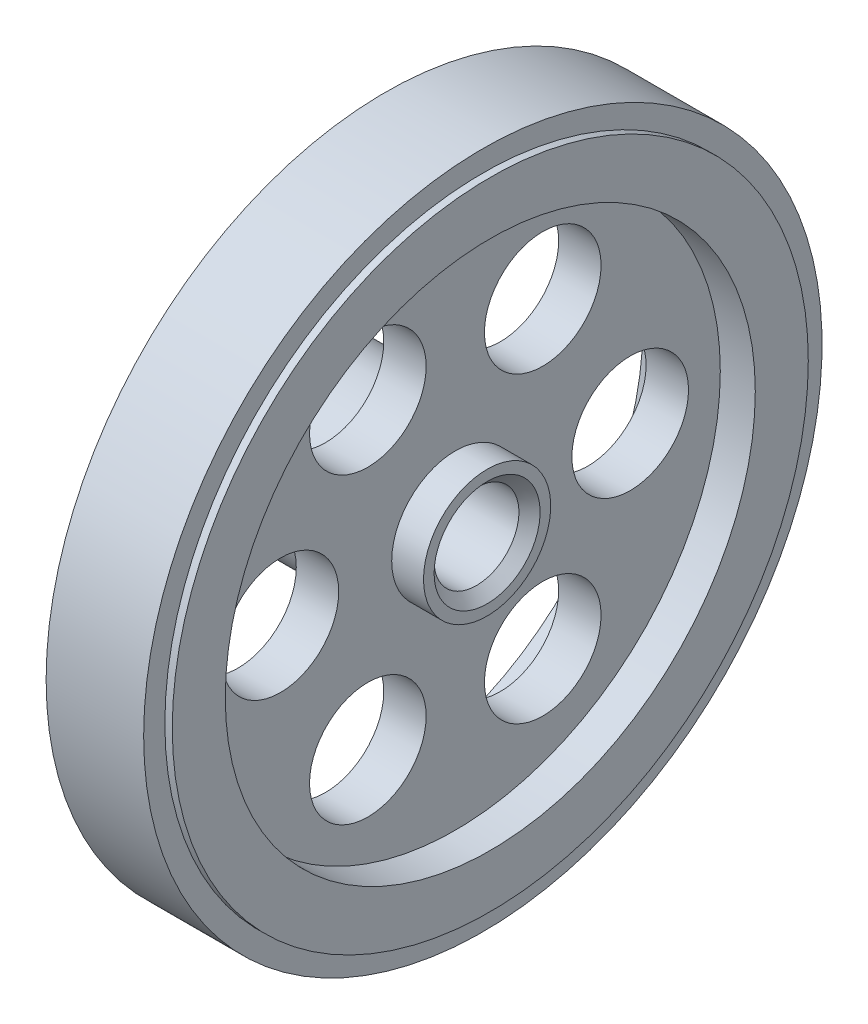
ISO-10303-21;
HEADER;
FILE_DESCRIPTION(('STEP AP214'),'2;1');
FILE_NAME('part.step','',(''),(''),'','','');
FILE_SCHEMA(('AUTOMOTIVE_DESIGN { 1 0 10303 214 1 1 1 1 }'));
ENDSEC;
DATA;
#1=APPLICATION_CONTEXT('core data for automotive mechanical design processes');
#2=APPLICATION_PROTOCOL_DEFINITION('international standard','automotive_design',2000,#1);
#3=PRODUCT_CONTEXT('',#1,'mechanical');
#4=PRODUCT('Part','Part','',(#3));
#5=PRODUCT_RELATED_PRODUCT_CATEGORY('part','',(#4));
#6=PRODUCT_DEFINITION_FORMATION('','',#4);
#7=PRODUCT_DEFINITION_CONTEXT('part definition',#1,'design');
#8=PRODUCT_DEFINITION('design','',#6,#7);
#9=PRODUCT_DEFINITION_SHAPE('','',#8);
#10=(LENGTH_UNIT() NAMED_UNIT(*) SI_UNIT(.MILLI.,.METRE.));
#11=(NAMED_UNIT(*) PLANE_ANGLE_UNIT() SI_UNIT($,.RADIAN.));
#12=(NAMED_UNIT(*) SI_UNIT($,.STERADIAN.) SOLID_ANGLE_UNIT());
#13=UNCERTAINTY_MEASURE_WITH_UNIT(LENGTH_MEASURE(1.E-05),#10,'distance_accuracy_value','');
#14=(GEOMETRIC_REPRESENTATION_CONTEXT(3) GLOBAL_UNCERTAINTY_ASSIGNED_CONTEXT((#13)) GLOBAL_UNIT_ASSIGNED_CONTEXT((#10,
#11,#12)) REPRESENTATION_CONTEXT('',''));
#15=CARTESIAN_POINT('',(0.,0.,0.));
#16=DIRECTION('',(0.,0.,1.));
#17=DIRECTION('',(1.,0.,0.));
#18=AXIS2_PLACEMENT_3D('',#15,#16,#17);
#19=CARTESIAN_POINT('',(17.,0.,-6.));
#20=DIRECTION('',(-1.,0.,0.));
#21=DIRECTION('',(0.,0.,1.));
#22=AXIS2_PLACEMENT_3D('',#19,#20,#21);
#23=PLANE('',#22);
#24=CARTESIAN_POINT('',(17.,0.,0.));
#25=DIRECTION('',(-1.,0.,0.));
#26=DIRECTION('',(0.,0.,1.));
#27=AXIS2_PLACEMENT_3D('',#24,#25,#26);
#28=CIRCLE('',#27,5.00000000000002);
#29=CARTESIAN_POINT('',(17.,0.,5.00000000000002));
#30=VERTEX_POINT('',#29);
#31=EDGE_CURVE('E10',#30,#30,#28,.T.);
#32=ORIENTED_EDGE('',*,*,#31,.T.);
#33=EDGE_LOOP('',(#32));
#34=FACE_BOUND('',#33,.T.);
#35=CARTESIAN_POINT('',(17.,0.,0.));
#36=DIRECTION('',(-1.,0.,0.));
#37=DIRECTION('',(0.,0.,1.));
#38=AXIS2_PLACEMENT_3D('',#35,#36,#37);
#39=CIRCLE('',#38,6.);
#40=CARTESIAN_POINT('',(17.,0.,6.));
#41=VERTEX_POINT('',#40);
#42=EDGE_CURVE('E89',#41,#41,#39,.T.);
#43=ORIENTED_EDGE('',*,*,#42,.F.);
#44=EDGE_LOOP('',(#43));
#45=FACE_BOUND('',#44,.T.);
#46=ADVANCED_FACE('F39',(#34,#45),#23,.F.);
#47=CARTESIAN_POINT('',(0.,0.,0.));
#48=DIRECTION('',(-1.,0.,0.));
#49=DIRECTION('',(0.,0.,1.));
#50=AXIS2_PLACEMENT_3D('',#47,#48,#49);
#51=CYLINDRICAL_SURFACE('',#50,4.);
#52=CARTESIAN_POINT('',(1.00000000000002,0.,0.));
#53=DIRECTION('',(1.,0.,0.));
#54=DIRECTION('',(0.,0.,-1.));
#55=AXIS2_PLACEMENT_3D('',#52,#53,#54);
#56=CIRCLE('',#55,4.);
#57=CARTESIAN_POINT('',(1.00000000000002,0.,-4.));
#58=VERTEX_POINT('',#57);
#59=EDGE_CURVE('E53',#58,#58,#56,.F.);
#60=ORIENTED_EDGE('',*,*,#59,.T.);
#61=EDGE_LOOP('',(#60));
#62=FACE_BOUND('',#61,.T.);
#63=CARTESIAN_POINT('',(16.,0.,0.));
#64=DIRECTION('',(-1.,0.,0.));
#65=DIRECTION('',(0.,0.,1.));
#66=AXIS2_PLACEMENT_3D('',#63,#64,#65);
#67=CIRCLE('',#66,4.);
#68=CARTESIAN_POINT('',(16.,0.,4.));
#69=VERTEX_POINT('',#68);
#70=EDGE_CURVE('E131',#69,#69,#67,.F.);
#71=ORIENTED_EDGE('',*,*,#70,.T.);
#72=EDGE_LOOP('',(#71));
#73=FACE_BOUND('',#72,.T.);
#74=ADVANCED_FACE('F136',(#62,#73),#51,.F.);
#75=CARTESIAN_POINT('',(0.,0.,-4.));
#76=DIRECTION('',(1.,0.,0.));
#77=DIRECTION('',(0.,0.,-1.));
#78=AXIS2_PLACEMENT_3D('',#75,#76,#77);
#79=PLANE('',#78);
#80=CARTESIAN_POINT('',(0.,0.,0.));
#81=DIRECTION('',(1.,0.,0.));
#82=DIRECTION('',(0.,0.,-1.));
#83=AXIS2_PLACEMENT_3D('',#80,#81,#82);
#84=CIRCLE('',#83,5.00000000000002);
#85=CARTESIAN_POINT('',(0.,0.,-5.00000000000002));
#86=VERTEX_POINT('',#85);
#87=EDGE_CURVE('E48',#86,#86,#84,.T.);
#88=ORIENTED_EDGE('',*,*,#87,.T.);
#89=EDGE_LOOP('',(#88));
#90=FACE_BOUND('',#89,.T.);
#91=CARTESIAN_POINT('',(0.,0.,0.));
#92=DIRECTION('',(-1.,0.,0.));
#93=DIRECTION('',(0.,0.,1.));
#94=AXIS2_PLACEMENT_3D('',#91,#92,#93);
#95=CIRCLE('',#94,8.);
#96=CARTESIAN_POINT('',(0.,0.,8.));
#97=VERTEX_POINT('',#96);
#98=EDGE_CURVE('E128',#97,#97,#95,.T.);
#99=ORIENTED_EDGE('',*,*,#98,.T.);
#100=EDGE_LOOP('',(#99));
#101=FACE_BOUND('',#100,.T.);
#102=ADVANCED_FACE('F159',(#90,#101),#79,.F.);
#103=CARTESIAN_POINT('',(0.,0.,0.));
#104=DIRECTION('',(-1.,0.,0.));
#105=DIRECTION('',(0.,0.,1.));
#106=AXIS2_PLACEMENT_3D('',#103,#104,#105);
#107=CYLINDRICAL_SURFACE('',#106,8.);
#108=ORIENTED_EDGE('',*,*,#98,.F.);
#109=EDGE_LOOP('',(#108));
#110=FACE_BOUND('',#109,.T.);
#111=CARTESIAN_POINT('',(10.,0.,0.));
#112=DIRECTION('',(-1.,0.,0.));
#113=DIRECTION('',(0.,0.,1.));
#114=AXIS2_PLACEMENT_3D('',#111,#112,#113);
#115=CIRCLE('',#114,8.);
#116=CARTESIAN_POINT('',(10.,0.,8.));
#117=VERTEX_POINT('',#116);
#118=EDGE_CURVE('E125',#117,#117,#115,.T.);
#119=ORIENTED_EDGE('',*,*,#118,.T.);
#120=EDGE_LOOP('',(#119));
#121=FACE_BOUND('',#120,.T.);
#122=ADVANCED_FACE('F165',(#110,#121),#107,.T.);
#123=CARTESIAN_POINT('',(10.,0.,-8.));
#124=DIRECTION('',(1.,0.,0.));
#125=DIRECTION('',(0.,0.,-1.));
#126=AXIS2_PLACEMENT_3D('',#123,#124,#125);
#127=PLANE('',#126);
#128=CARTESIAN_POINT('',(10.,14.2894191624433,8.24999999999997));
#129=DIRECTION('',(1.,0.,0.));
#130=DIRECTION('',(0.,0.,-1.));
#131=AXIS2_PLACEMENT_3D('',#128,#129,#130);
#132=CIRCLE('',#131,5.5);
#133=CARTESIAN_POINT('',(10.,14.2894191624433,2.74999999999997));
#134=VERTEX_POINT('',#133);
#135=EDGE_CURVE('E86',#134,#134,#132,.T.);
#136=ORIENTED_EDGE('',*,*,#135,.T.);
#137=EDGE_LOOP('',(#136));
#138=FACE_BOUND('',#137,.T.);
#139=CARTESIAN_POINT('',(10.,14.2894191624432,-8.25000000000007));
#140=DIRECTION('',(1.,0.,0.));
#141=DIRECTION('',(0.,0.,-1.));
#142=AXIS2_PLACEMENT_3D('',#139,#140,#141);
#143=CIRCLE('',#142,5.5);
#144=CARTESIAN_POINT('',(10.,14.2894191624432,-13.7500000000001));
#145=VERTEX_POINT('',#144);
#146=EDGE_CURVE('E74',#145,#145,#143,.T.);
#147=ORIENTED_EDGE('',*,*,#146,.T.);
#148=EDGE_LOOP('',(#147));
#149=FACE_BOUND('',#148,.T.);
#150=CARTESIAN_POINT('',(10.,-1.1319821696323E-13,-16.5));
#151=DIRECTION('',(1.,0.,0.));
#152=DIRECTION('',(0.,0.,-1.));
#153=AXIS2_PLACEMENT_3D('',#150,#151,#152);
#154=CIRCLE('',#153,5.5);
#155=CARTESIAN_POINT('',(10.,-1.1319821696323E-13,-22.));
#156=VERTEX_POINT('',#155);
#157=EDGE_CURVE('E71',#156,#156,#154,.T.);
#158=ORIENTED_EDGE('',*,*,#157,.T.);
#159=EDGE_LOOP('',(#158));
#160=FACE_BOUND('',#159,.T.);
#161=CARTESIAN_POINT('',(10.,-14.2894191624433,-8.24999999999987));
#162=DIRECTION('',(1.,0.,0.));
#163=DIRECTION('',(0.,0.,-1.));
#164=AXIS2_PLACEMENT_3D('',#161,#162,#163);
#165=CIRCLE('',#164,5.5);
#166=CARTESIAN_POINT('',(10.,-14.2894191624433,-13.7499999999999));
#167=VERTEX_POINT('',#166);
#168=EDGE_CURVE('E68',#167,#167,#165,.T.);
#169=ORIENTED_EDGE('',*,*,#168,.T.);
#170=EDGE_LOOP('',(#169));
#171=FACE_BOUND('',#170,.T.);
#172=CARTESIAN_POINT('',(10.,-14.2894191624431,8.25000000000017));
#173=DIRECTION('',(1.,0.,0.));
#174=DIRECTION('',(0.,0.,-1.));
#175=AXIS2_PLACEMENT_3D('',#172,#173,#174);
#176=CIRCLE('',#175,5.5);
#177=CARTESIAN_POINT('',(10.,-14.2894191624431,2.75000000000017));
#178=VERTEX_POINT('',#177);
#179=EDGE_CURVE('E64',#178,#178,#176,.T.);
#180=ORIENTED_EDGE('',*,*,#179,.T.);
#181=EDGE_LOOP('',(#180));
#182=FACE_BOUND('',#181,.T.);
#183=CARTESIAN_POINT('',(10.,0.,16.5));
#184=DIRECTION('',(1.,0.,0.));
#185=DIRECTION('',(0.,0.,-1.));
#186=AXIS2_PLACEMENT_3D('',#183,#184,#185);
#187=CIRCLE('',#186,5.5);
#188=CARTESIAN_POINT('',(10.,0.,11.));
#189=VERTEX_POINT('',#188);
#190=EDGE_CURVE('E60',#189,#189,#187,.T.);
#191=ORIENTED_EDGE('',*,*,#190,.T.);
#192=EDGE_LOOP('',(#191));
#193=FACE_BOUND('',#192,.T.);
#194=ORIENTED_EDGE('',*,*,#118,.F.);
#195=EDGE_LOOP('',(#194));
#196=FACE_BOUND('',#195,.T.);
#197=CARTESIAN_POINT('',(10.,0.,0.));
#198=DIRECTION('',(-1.,0.,0.));
#199=DIRECTION('',(0.,0.,1.));
#200=AXIS2_PLACEMENT_3D('',#197,#198,#199);
#201=CIRCLE('',#200,25.);
#202=CARTESIAN_POINT('',(10.,0.,25.));
#203=VERTEX_POINT('',#202);
#204=EDGE_CURVE('E122',#203,#203,#201,.T.);
#205=ORIENTED_EDGE('',*,*,#204,.T.);
#206=EDGE_LOOP('',(#205));
#207=FACE_BOUND('',#206,.T.);
#208=ADVANCED_FACE('F169',(#138,#149,#160,#171,#182,#193,#196,#207),#127,.F.);
#209=CARTESIAN_POINT('',(0.,0.,0.));
#210=DIRECTION('',(-1.,0.,0.));
#211=DIRECTION('',(0.,0.,1.));
#212=AXIS2_PLACEMENT_3D('',#209,#210,#211);
#213=CYLINDRICAL_SURFACE('',#212,25.);
#214=ORIENTED_EDGE('',*,*,#204,.F.);
#215=EDGE_LOOP('',(#214));
#216=FACE_BOUND('',#215,.T.);
#217=CARTESIAN_POINT('',(6.7,0.,0.));
#218=DIRECTION('',(-1.,0.,0.));
#219=DIRECTION('',(0.,0.,1.));
#220=AXIS2_PLACEMENT_3D('',#217,#218,#219);
#221=CIRCLE('',#220,25.);
#222=CARTESIAN_POINT('',(6.7,0.,25.));
#223=VERTEX_POINT('',#222);
#224=EDGE_CURVE('E119',#223,#223,#221,.T.);
#225=ORIENTED_EDGE('',*,*,#224,.T.);
#226=EDGE_LOOP('',(#225));
#227=FACE_BOUND('',#226,.T.);
#228=ADVANCED_FACE('F173',(#216,#227),#213,.F.);
#229=CARTESIAN_POINT('',(6.7,0.,-25.));
#230=DIRECTION('',(1.,0.,0.));
#231=DIRECTION('',(0.,0.,-1.));
#232=AXIS2_PLACEMENT_3D('',#229,#230,#231);
#233=PLANE('',#232);
#234=ORIENTED_EDGE('',*,*,#224,.F.);
#235=EDGE_LOOP('',(#234));
#236=FACE_BOUND('',#235,.T.);
#237=CARTESIAN_POINT('',(6.7,0.,0.));
#238=DIRECTION('',(-1.,0.,0.));
#239=DIRECTION('',(0.,0.,1.));
#240=AXIS2_PLACEMENT_3D('',#237,#238,#239);
#241=CIRCLE('',#240,30.);
#242=CARTESIAN_POINT('',(6.7,0.,30.));
#243=VERTEX_POINT('',#242);
#244=EDGE_CURVE('E116',#243,#243,#241,.T.);
#245=ORIENTED_EDGE('',*,*,#244,.T.);
#246=EDGE_LOOP('',(#245));
#247=FACE_BOUND('',#246,.T.);
#248=ADVANCED_FACE('F177',(#236,#247),#233,.F.);
#249=CARTESIAN_POINT('',(0.,0.,0.));
#250=DIRECTION('',(-1.,0.,0.));
#251=DIRECTION('',(0.,0.,1.));
#252=AXIS2_PLACEMENT_3D('',#249,#250,#251);
#253=CYLINDRICAL_SURFACE('',#252,30.);
#254=ORIENTED_EDGE('',*,*,#244,.F.);
#255=EDGE_LOOP('',(#254));
#256=FACE_BOUND('',#255,.T.);
#257=CARTESIAN_POINT('',(7.4,0.,0.));
#258=DIRECTION('',(-1.,0.,0.));
#259=DIRECTION('',(0.,0.,1.));
#260=AXIS2_PLACEMENT_3D('',#257,#258,#259);
#261=CIRCLE('',#260,30.);
#262=CARTESIAN_POINT('',(7.4,0.,30.));
#263=VERTEX_POINT('',#262);
#264=EDGE_CURVE('E113',#263,#263,#261,.T.);
#265=ORIENTED_EDGE('',*,*,#264,.T.);
#266=EDGE_LOOP('',(#265));
#267=FACE_BOUND('',#266,.T.);
#268=ADVANCED_FACE('F181',(#256,#267),#253,.T.);
#269=CARTESIAN_POINT('',(7.4,0.,-30.));
#270=DIRECTION('',(1.,0.,0.));
#271=DIRECTION('',(0.,0.,-1.));
#272=AXIS2_PLACEMENT_3D('',#269,#270,#271);
#273=PLANE('',#272);
#274=ORIENTED_EDGE('',*,*,#264,.F.);
#275=EDGE_LOOP('',(#274));
#276=FACE_BOUND('',#275,.T.);
#277=CARTESIAN_POINT('',(7.4,0.,0.));
#278=DIRECTION('',(-1.,0.,0.));
#279=DIRECTION('',(0.,0.,1.));
#280=AXIS2_PLACEMENT_3D('',#277,#278,#279);
#281=CIRCLE('',#280,32.);
#282=CARTESIAN_POINT('',(7.4,0.,32.));
#283=VERTEX_POINT('',#282);
#284=EDGE_CURVE('E110',#283,#283,#281,.T.);
#285=ORIENTED_EDGE('',*,*,#284,.T.);
#286=EDGE_LOOP('',(#285));
#287=FACE_BOUND('',#286,.T.);
#288=ADVANCED_FACE('F185',(#276,#287),#273,.F.);
#289=CARTESIAN_POINT('',(0.,0.,0.));
#290=DIRECTION('',(-1.,0.,0.));
#291=DIRECTION('',(0.,0.,1.));
#292=AXIS2_PLACEMENT_3D('',#289,#290,#291);
#293=CYLINDRICAL_SURFACE('',#292,32.);
#294=ORIENTED_EDGE('',*,*,#284,.F.);
#295=EDGE_LOOP('',(#294));
#296=FACE_BOUND('',#295,.T.);
#297=CARTESIAN_POINT('',(16.6,0.,0.));
#298=DIRECTION('',(-1.,0.,0.));
#299=DIRECTION('',(0.,0.,1.));
#300=AXIS2_PLACEMENT_3D('',#297,#298,#299);
#301=CIRCLE('',#300,32.);
#302=CARTESIAN_POINT('',(16.6,0.,32.));
#303=VERTEX_POINT('',#302);
#304=EDGE_CURVE('E107',#303,#303,#301,.T.);
#305=ORIENTED_EDGE('',*,*,#304,.T.);
#306=EDGE_LOOP('',(#305));
#307=FACE_BOUND('',#306,.T.);
#308=ADVANCED_FACE('F189',(#296,#307),#293,.T.);
#309=CARTESIAN_POINT('',(16.6,0.,-30.));
#310=DIRECTION('',(-1.,0.,0.));
#311=DIRECTION('',(0.,0.,1.));
#312=AXIS2_PLACEMENT_3D('',#309,#310,#311);
#313=PLANE('',#312);
#314=ORIENTED_EDGE('',*,*,#304,.F.);
#315=EDGE_LOOP('',(#314));
#316=FACE_BOUND('',#315,.T.);
#317=CARTESIAN_POINT('',(16.6,0.,0.));
#318=DIRECTION('',(-1.,0.,0.));
#319=DIRECTION('',(0.,0.,1.));
#320=AXIS2_PLACEMENT_3D('',#317,#318,#319);
#321=CIRCLE('',#320,30.);
#322=CARTESIAN_POINT('',(16.6,0.,30.));
#323=VERTEX_POINT('',#322);
#324=EDGE_CURVE('E104',#323,#323,#321,.T.);
#325=ORIENTED_EDGE('',*,*,#324,.T.);
#326=EDGE_LOOP('',(#325));
#327=FACE_BOUND('',#326,.T.);
#328=ADVANCED_FACE('F193',(#316,#327),#313,.F.);
#329=CARTESIAN_POINT('',(0.,0.,0.));
#330=DIRECTION('',(-1.,0.,0.));
#331=DIRECTION('',(0.,0.,1.));
#332=AXIS2_PLACEMENT_3D('',#329,#330,#331);
#333=CYLINDRICAL_SURFACE('',#332,30.);
#334=ORIENTED_EDGE('',*,*,#324,.F.);
#335=EDGE_LOOP('',(#334));
#336=FACE_BOUND('',#335,.T.);
#337=CARTESIAN_POINT('',(17.3,0.,0.));
#338=DIRECTION('',(-1.,0.,0.));
#339=DIRECTION('',(0.,0.,1.));
#340=AXIS2_PLACEMENT_3D('',#337,#338,#339);
#341=CIRCLE('',#340,30.);
#342=CARTESIAN_POINT('',(17.3,0.,30.));
#343=VERTEX_POINT('',#342);
#344=EDGE_CURVE('E101',#343,#343,#341,.T.);
#345=ORIENTED_EDGE('',*,*,#344,.T.);
#346=EDGE_LOOP('',(#345));
#347=FACE_BOUND('',#346,.T.);
#348=ADVANCED_FACE('F197',(#336,#347),#333,.T.);
#349=CARTESIAN_POINT('',(17.3,0.,-25.));
#350=DIRECTION('',(-1.,0.,0.));
#351=DIRECTION('',(0.,0.,1.));
#352=AXIS2_PLACEMENT_3D('',#349,#350,#351);
#353=PLANE('',#352);
#354=ORIENTED_EDGE('',*,*,#344,.F.);
#355=EDGE_LOOP('',(#354));
#356=FACE_BOUND('',#355,.T.);
#357=CARTESIAN_POINT('',(17.3,0.,0.));
#358=DIRECTION('',(-1.,0.,0.));
#359=DIRECTION('',(0.,0.,1.));
#360=AXIS2_PLACEMENT_3D('',#357,#358,#359);
#361=CIRCLE('',#360,25.);
#362=CARTESIAN_POINT('',(17.3,0.,25.));
#363=VERTEX_POINT('',#362);
#364=EDGE_CURVE('E98',#363,#363,#361,.T.);
#365=ORIENTED_EDGE('',*,*,#364,.T.);
#366=EDGE_LOOP('',(#365));
#367=FACE_BOUND('',#366,.T.);
#368=ADVANCED_FACE('F201',(#356,#367),#353,.F.);
#369=CARTESIAN_POINT('',(0.,0.,0.));
#370=DIRECTION('',(-1.,0.,0.));
#371=DIRECTION('',(0.,0.,1.));
#372=AXIS2_PLACEMENT_3D('',#369,#370,#371);
#373=CYLINDRICAL_SURFACE('',#372,25.);
#374=ORIENTED_EDGE('',*,*,#364,.F.);
#375=EDGE_LOOP('',(#374));
#376=FACE_BOUND('',#375,.T.);
#377=CARTESIAN_POINT('',(14.,0.,0.));
#378=DIRECTION('',(-1.,0.,0.));
#379=DIRECTION('',(0.,0.,1.));
#380=AXIS2_PLACEMENT_3D('',#377,#378,#379);
#381=CIRCLE('',#380,25.);
#382=CARTESIAN_POINT('',(14.,0.,25.));
#383=VERTEX_POINT('',#382);
#384=EDGE_CURVE('E95',#383,#383,#381,.T.);
#385=ORIENTED_EDGE('',*,*,#384,.T.);
#386=EDGE_LOOP('',(#385));
#387=FACE_BOUND('',#386,.T.);
#388=ADVANCED_FACE('F205',(#376,#387),#373,.F.);
#389=CARTESIAN_POINT('',(14.,0.,-25.));
#390=DIRECTION('',(-1.,0.,0.));
#391=DIRECTION('',(0.,0.,1.));
#392=AXIS2_PLACEMENT_3D('',#389,#390,#391);
#393=PLANE('',#392);
#394=CARTESIAN_POINT('',(14.,14.2894191624433,8.24999999999997));
#395=DIRECTION('',(-1.,0.,0.));
#396=DIRECTION('',(0.,0.,1.));
#397=AXIS2_PLACEMENT_3D('',#394,#395,#396);
#398=CIRCLE('',#397,5.5);
#399=CARTESIAN_POINT('',(14.,14.2894191624433,13.75));
#400=VERTEX_POINT('',#399);
#401=EDGE_CURVE('E44',#400,#400,#398,.T.);
#402=ORIENTED_EDGE('',*,*,#401,.T.);
#403=EDGE_LOOP('',(#402));
#404=FACE_BOUND('',#403,.T.);
#405=CARTESIAN_POINT('',(14.,14.2894191624432,-8.25000000000007));
#406=DIRECTION('',(-1.,0.,0.));
#407=DIRECTION('',(0.,0.,1.));
#408=AXIS2_PLACEMENT_3D('',#405,#406,#407);
#409=CIRCLE('',#408,5.5);
#410=CARTESIAN_POINT('',(14.,14.2894191624432,-2.75000000000006));
#411=VERTEX_POINT('',#410);
#412=EDGE_CURVE('E72',#411,#411,#409,.T.);
#413=ORIENTED_EDGE('',*,*,#412,.T.);
#414=EDGE_LOOP('',(#413));
#415=FACE_BOUND('',#414,.T.);
#416=CARTESIAN_POINT('',(14.,-1.1319821696323E-13,-16.5));
#417=DIRECTION('',(-1.,0.,0.));
#418=DIRECTION('',(0.,0.,1.));
#419=AXIS2_PLACEMENT_3D('',#416,#417,#418);
#420=CIRCLE('',#419,5.5);
#421=CARTESIAN_POINT('',(14.,-1.1319821696323E-13,-11.));
#422=VERTEX_POINT('',#421);
#423=EDGE_CURVE('E69',#422,#422,#420,.T.);
#424=ORIENTED_EDGE('',*,*,#423,.T.);
#425=EDGE_LOOP('',(#424));
#426=FACE_BOUND('',#425,.T.);
#427=CARTESIAN_POINT('',(14.,-14.2894191624433,-8.24999999999987));
#428=DIRECTION('',(-1.,0.,0.));
#429=DIRECTION('',(0.,0.,1.));
#430=AXIS2_PLACEMENT_3D('',#427,#428,#429);
#431=CIRCLE('',#430,5.5);
#432=CARTESIAN_POINT('',(14.,-14.2894191624433,-2.74999999999987));
#433=VERTEX_POINT('',#432);
#434=EDGE_CURVE('E65',#433,#433,#431,.T.);
#435=ORIENTED_EDGE('',*,*,#434,.T.);
#436=EDGE_LOOP('',(#435));
#437=FACE_BOUND('',#436,.T.);
#438=CARTESIAN_POINT('',(14.,-14.2894191624431,8.25000000000017));
#439=DIRECTION('',(-1.,0.,0.));
#440=DIRECTION('',(0.,0.,1.));
#441=AXIS2_PLACEMENT_3D('',#438,#439,#440);
#442=CIRCLE('',#441,5.5);
#443=CARTESIAN_POINT('',(14.,-14.2894191624431,13.7500000000002));
#444=VERTEX_POINT('',#443);
#445=EDGE_CURVE('E61',#444,#444,#442,.T.);
#446=ORIENTED_EDGE('',*,*,#445,.T.);
#447=EDGE_LOOP('',(#446));
#448=FACE_BOUND('',#447,.T.);
#449=CARTESIAN_POINT('',(14.,0.,16.5));
#450=DIRECTION('',(-1.,0.,0.));
#451=DIRECTION('',(0.,0.,1.));
#452=AXIS2_PLACEMENT_3D('',#449,#450,#451);
#453=CIRCLE('',#452,5.5);
#454=CARTESIAN_POINT('',(14.,0.,22.));
#455=VERTEX_POINT('',#454);
#456=EDGE_CURVE('E57',#455,#455,#453,.T.);
#457=ORIENTED_EDGE('',*,*,#456,.T.);
#458=EDGE_LOOP('',(#457));
#459=FACE_BOUND('',#458,.T.);
#460=ORIENTED_EDGE('',*,*,#384,.F.);
#461=EDGE_LOOP('',(#460));
#462=FACE_BOUND('',#461,.T.);
#463=CARTESIAN_POINT('',(14.,0.,0.));
#464=DIRECTION('',(-1.,0.,0.));
#465=DIRECTION('',(0.,0.,1.));
#466=AXIS2_PLACEMENT_3D('',#463,#464,#465);
#467=CIRCLE('',#466,6.);
#468=CARTESIAN_POINT('',(14.,0.,6.));
#469=VERTEX_POINT('',#468);
#470=EDGE_CURVE('E92',#469,#469,#467,.T.);
#471=ORIENTED_EDGE('',*,*,#470,.T.);
#472=EDGE_LOOP('',(#471));
#473=FACE_BOUND('',#472,.T.);
#474=ADVANCED_FACE('F149',(#404,#415,#426,#437,#448,#459,#462,#473),#393,.F.);
#475=CARTESIAN_POINT('',(0.,0.,0.));
#476=DIRECTION('',(-1.,0.,0.));
#477=DIRECTION('',(0.,0.,1.));
#478=AXIS2_PLACEMENT_3D('',#475,#476,#477);
#479=CYLINDRICAL_SURFACE('',#478,6.);
#480=ORIENTED_EDGE('',*,*,#470,.F.);
#481=EDGE_LOOP('',(#480));
#482=FACE_BOUND('',#481,.T.);
#483=ORIENTED_EDGE('',*,*,#42,.T.);
#484=EDGE_LOOP('',(#483));
#485=FACE_BOUND('',#484,.T.);
#486=ADVANCED_FACE('F141',(#482,#485),#479,.T.);
#487=CARTESIAN_POINT('',(1.00000000000002,0.,0.));
#488=DIRECTION('',(-1.,0.,0.));
#489=DIRECTION('',(0.,0.,1.));
#490=AXIS2_PLACEMENT_3D('',#487,#488,#489);
#491=CONICAL_SURFACE('',#490,4.,0.785398163397448);
#492=ORIENTED_EDGE('',*,*,#87,.F.);
#493=EDGE_LOOP('',(#492));
#494=FACE_BOUND('',#493,.T.);
#495=ORIENTED_EDGE('',*,*,#59,.F.);
#496=EDGE_LOOP('',(#495));
#497=FACE_BOUND('',#496,.T.);
#498=ADVANCED_FACE('F139',(#494,#497),#491,.F.);
#499=CARTESIAN_POINT('',(17.,0.,0.));
#500=DIRECTION('',(1.,0.,0.));
#501=DIRECTION('',(0.,0.,-1.));
#502=AXIS2_PLACEMENT_3D('',#499,#500,#501);
#503=CONICAL_SURFACE('',#502,5.00000000000002,0.785398163397448);
#504=ORIENTED_EDGE('',*,*,#70,.F.);
#505=EDGE_LOOP('',(#504));
#506=FACE_BOUND('',#505,.T.);
#507=ORIENTED_EDGE('',*,*,#31,.F.);
#508=EDGE_LOOP('',(#507));
#509=FACE_BOUND('',#508,.T.);
#510=ADVANCED_FACE('F42',(#506,#509),#503,.F.);
#511=CARTESIAN_POINT('',(0.,0.,16.5));
#512=DIRECTION('',(1.,0.,0.));
#513=DIRECTION('',(0.,0.,-1.));
#514=AXIS2_PLACEMENT_3D('',#511,#512,#513);
#515=CYLINDRICAL_SURFACE('',#514,5.5);
#516=ORIENTED_EDGE('',*,*,#456,.F.);
#517=EDGE_LOOP('',(#516));
#518=FACE_BOUND('',#517,.T.);
#519=ORIENTED_EDGE('',*,*,#190,.F.);
#520=EDGE_LOOP('',(#519));
#521=FACE_BOUND('',#520,.T.);
#522=ADVANCED_FACE('F147',(#518,#521),#515,.F.);
#523=CARTESIAN_POINT('',(0.,-14.2894191624431,8.25000000000017));
#524=DIRECTION('',(1.,0.,0.));
#525=DIRECTION('',(0.,0.,-1.));
#526=AXIS2_PLACEMENT_3D('',#523,#524,#525);
#527=CYLINDRICAL_SURFACE('',#526,5.5);
#528=ORIENTED_EDGE('',*,*,#445,.F.);
#529=EDGE_LOOP('',(#528));
#530=FACE_BOUND('',#529,.T.);
#531=ORIENTED_EDGE('',*,*,#179,.F.);
#532=EDGE_LOOP('',(#531));
#533=FACE_BOUND('',#532,.T.);
#534=ADVANCED_FACE('F215',(#530,#533),#527,.F.);
#535=CARTESIAN_POINT('',(0.,-14.2894191624433,-8.24999999999987));
#536=DIRECTION('',(1.,0.,0.));
#537=DIRECTION('',(0.,0.,-1.));
#538=AXIS2_PLACEMENT_3D('',#535,#536,#537);
#539=CYLINDRICAL_SURFACE('',#538,5.5);
#540=ORIENTED_EDGE('',*,*,#434,.F.);
#541=EDGE_LOOP('',(#540));
#542=FACE_BOUND('',#541,.T.);
#543=ORIENTED_EDGE('',*,*,#168,.F.);
#544=EDGE_LOOP('',(#543));
#545=FACE_BOUND('',#544,.T.);
#546=ADVANCED_FACE('F217',(#542,#545),#539,.F.);
#547=CARTESIAN_POINT('',(0.,-1.1319821696323E-13,-16.5));
#548=DIRECTION('',(1.,0.,0.));
#549=DIRECTION('',(0.,0.,-1.));
#550=AXIS2_PLACEMENT_3D('',#547,#548,#549);
#551=CYLINDRICAL_SURFACE('',#550,5.5);
#552=ORIENTED_EDGE('',*,*,#423,.F.);
#553=EDGE_LOOP('',(#552));
#554=FACE_BOUND('',#553,.T.);
#555=ORIENTED_EDGE('',*,*,#157,.F.);
#556=EDGE_LOOP('',(#555));
#557=FACE_BOUND('',#556,.T.);
#558=ADVANCED_FACE('F220',(#554,#557),#551,.F.);
#559=CARTESIAN_POINT('',(0.,14.2894191624432,-8.25000000000007));
#560=DIRECTION('',(1.,0.,0.));
#561=DIRECTION('',(0.,0.,-1.));
#562=AXIS2_PLACEMENT_3D('',#559,#560,#561);
#563=CYLINDRICAL_SURFACE('',#562,5.5);
#564=ORIENTED_EDGE('',*,*,#412,.F.);
#565=EDGE_LOOP('',(#564));
#566=FACE_BOUND('',#565,.T.);
#567=ORIENTED_EDGE('',*,*,#146,.F.);
#568=EDGE_LOOP('',(#567));
#569=FACE_BOUND('',#568,.T.);
#570=ADVANCED_FACE('F224',(#566,#569),#563,.F.);
#571=CARTESIAN_POINT('',(0.,14.2894191624433,8.24999999999997));
#572=DIRECTION('',(1.,0.,0.));
#573=DIRECTION('',(0.,0.,-1.));
#574=AXIS2_PLACEMENT_3D('',#571,#572,#573);
#575=CYLINDRICAL_SURFACE('',#574,5.5);
#576=ORIENTED_EDGE('',*,*,#401,.F.);
#577=EDGE_LOOP('',(#576));
#578=FACE_BOUND('',#577,.T.);
#579=ORIENTED_EDGE('',*,*,#135,.F.);
#580=EDGE_LOOP('',(#579));
#581=FACE_BOUND('',#580,.T.);
#582=ADVANCED_FACE('F228',(#578,#581),#575,.F.);
#583=CLOSED_SHELL('',(#46,#74,#102,#122,#208,#228,#248,#268,#288,#308,#328,#348,#368,#388,#474,
#486,#498,#510,#522,#534,#546,#558,#570,#582));
#584=MANIFOLD_SOLID_BREP('B2',#583);
#585=ADVANCED_BREP_SHAPE_REPRESENTATION('',(#18,#584),#14);
#586=SHAPE_DEFINITION_REPRESENTATION(#9,#585);
ENDSEC;
END-ISO-10303-21;
